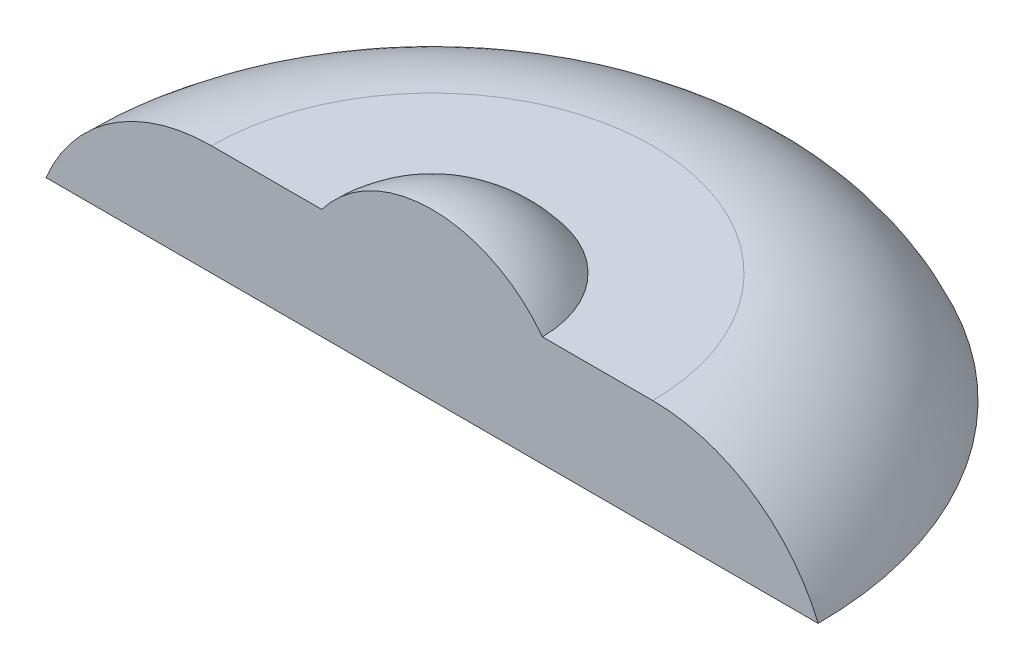
ISO-10303-21;
HEADER;
FILE_DESCRIPTION(('STEP AP214'),'2;1');
FILE_NAME('part.step','',(''),(''),'','','');
FILE_SCHEMA(('AUTOMOTIVE_DESIGN { 1 0 10303 214 1 1 1 1 }'));
ENDSEC;
DATA;
#1=APPLICATION_CONTEXT('core data for automotive mechanical design processes');
#2=APPLICATION_PROTOCOL_DEFINITION('international standard','automotive_design',2000,#1);
#3=PRODUCT_CONTEXT('',#1,'mechanical');
#4=PRODUCT('Part','Part','',(#3));
#5=PRODUCT_RELATED_PRODUCT_CATEGORY('part','',(#4));
#6=PRODUCT_DEFINITION_FORMATION('','',#4);
#7=PRODUCT_DEFINITION_CONTEXT('part definition',#1,'design');
#8=PRODUCT_DEFINITION('design','',#6,#7);
#9=PRODUCT_DEFINITION_SHAPE('','',#8);
#10=(LENGTH_UNIT() NAMED_UNIT(*) SI_UNIT(.MILLI.,.METRE.));
#11=(NAMED_UNIT(*) PLANE_ANGLE_UNIT() SI_UNIT($,.RADIAN.));
#12=(NAMED_UNIT(*) SI_UNIT($,.STERADIAN.) SOLID_ANGLE_UNIT());
#13=UNCERTAINTY_MEASURE_WITH_UNIT(LENGTH_MEASURE(1.E-05),#10,'distance_accuracy_value','');
#14=(GEOMETRIC_REPRESENTATION_CONTEXT(3) GLOBAL_UNCERTAINTY_ASSIGNED_CONTEXT((#13)) GLOBAL_UNIT_ASSIGNED_CONTEXT((#10,
#11,#12)) REPRESENTATION_CONTEXT('',''));
#15=CARTESIAN_POINT('',(0.,0.,0.));
#16=DIRECTION('',(0.,0.,1.));
#17=DIRECTION('',(1.,0.,0.));
#18=AXIS2_PLACEMENT_3D('',#15,#16,#17);
#19=CARTESIAN_POINT('',(-88.9,0.,6.20785382046309E-13));
#20=DIRECTION('',(0.,-1.,0.));
#21=DIRECTION('',(0.,0.,-1.));
#22=AXIS2_PLACEMENT_3D('',#19,#20,#21);
#23=PLANE('',#22);
#24=CARTESIAN_POINT('',(0.,0.,0.));
#25=DIRECTION('',(0.,-1.,0.));
#26=DIRECTION('',(0.,0.,-1.));
#27=AXIS2_PLACEMENT_3D('',#24,#25,#26);
#28=CIRCLE('',#27,88.9);
#29=CARTESIAN_POINT('',(-88.9,0.,6.20785382046309E-13));
#30=VERTEX_POINT('',#29);
#31=CARTESIAN_POINT('',(88.9,0.,0.));
#32=VERTEX_POINT('',#31);
#33=EDGE_CURVE('E80',#30,#32,#28,.T.);
#34=ORIENTED_EDGE('',*,*,#33,.T.);
#35=DIRECTION('',(-1.,0.,0.));
#36=VECTOR('',#35,1.);
#37=CARTESIAN_POINT('',(-88.9,0.,6.20785382046309E-13));
#38=LINE('',#37,#36);
#39=EDGE_CURVE('E69',#32,#30,#38,.T.);
#40=ORIENTED_EDGE('',*,*,#39,.T.);
#41=EDGE_LOOP('',(#34,#40));
#42=FACE_BOUND('',#41,.T.);
#43=ADVANCED_FACE('F36',(#42),#23,.T.);
#44=CARTESIAN_POINT('',(0.,6.34999999999999,0.));
#45=DIRECTION('',(0.,-1.,0.));
#46=DIRECTION('',(-1.,0.,0.));
#47=AXIS2_PLACEMENT_3D('',#44,#45,#46);
#48=SPHERICAL_SURFACE('',#47,31.75);
#49=CARTESIAN_POINT('',(0.,25.4,0.));
#50=DIRECTION('',(0.,-1.,0.));
#51=DIRECTION('',(0.,0.,-1.));
#52=AXIS2_PLACEMENT_3D('',#49,#50,#51);
#53=CIRCLE('',#52,25.4);
#54=CARTESIAN_POINT('',(-25.4,25.4,1.77367252013231E-13));
#55=VERTEX_POINT('',#54);
#56=CARTESIAN_POINT('',(25.4,25.4,0.));
#57=VERTEX_POINT('',#56);
#58=EDGE_CURVE('E11',#55,#57,#53,.T.);
#59=ORIENTED_EDGE('',*,*,#58,.F.);
#60=CARTESIAN_POINT('',(0.,6.34999999999999,0.));
#61=DIRECTION('',(0.,0.,-1.));
#62=DIRECTION('',(1.,0.,0.));
#63=AXIS2_PLACEMENT_3D('',#60,#61,#62);
#64=CIRCLE('',#63,31.75);
#65=EDGE_CURVE('E82',#55,#57,#64,.T.);
#66=ORIENTED_EDGE('',*,*,#65,.T.);
#67=EDGE_LOOP('',(#59,#66));
#68=FACE_BOUND('',#67,.T.);
#69=ADVANCED_FACE('F38',(#68),#48,.T.);
#70=CARTESIAN_POINT('',(-25.4,25.4,1.77367252013231E-13));
#71=DIRECTION('',(0.,1.,0.));
#72=DIRECTION('',(0.,0.,1.));
#73=AXIS2_PLACEMENT_3D('',#70,#71,#72);
#74=PLANE('',#73);
#75=CARTESIAN_POINT('',(0.,25.4,0.));
#76=DIRECTION('',(0.,-1.,0.));
#77=DIRECTION('',(0.,0.,-1.));
#78=AXIS2_PLACEMENT_3D('',#75,#76,#77);
#79=CIRCLE('',#78,50.8);
#80=CARTESIAN_POINT('',(-50.8,25.4,3.54734504026463E-13));
#81=VERTEX_POINT('',#80);
#82=CARTESIAN_POINT('',(50.8,25.4,0.));
#83=VERTEX_POINT('',#82);
#84=EDGE_CURVE('E44',#81,#83,#79,.T.);
#85=ORIENTED_EDGE('',*,*,#84,.F.);
#86=DIRECTION('',(1.,0.,0.));
#87=VECTOR('',#86,1.);
#88=CARTESIAN_POINT('',(-25.4,25.4,1.77367252013231E-13));
#89=LINE('',#88,#87);
#90=EDGE_CURVE('E89',#81,#55,#89,.T.);
#91=ORIENTED_EDGE('',*,*,#90,.T.);
#92=ORIENTED_EDGE('',*,*,#58,.T.);
#93=DIRECTION('',(-1.,0.,0.));
#94=VECTOR('',#93,1.);
#95=CARTESIAN_POINT('',(25.4,25.4,0.));
#96=LINE('',#95,#94);
#97=EDGE_CURVE('E78',#83,#57,#96,.T.);
#98=ORIENTED_EDGE('',*,*,#97,.F.);
#99=EDGE_LOOP('',(#85,#91,#92,#98));
#100=FACE_BOUND('',#99,.T.);
#101=ADVANCED_FACE('F92',(#100),#74,.T.);
#102=CARTESIAN_POINT('',(0.,-15.875,0.));
#103=DIRECTION('',(0.,-1.,0.));
#104=DIRECTION('',(0.,0.,-1.));
#105=AXIS2_PLACEMENT_3D('',#102,#103,#104);
#106=TOROIDAL_SURFACE('',#105,50.8,41.275);
#107=CARTESIAN_POINT('',(-50.8,-15.875,3.54734504026463E-13));
#108=DIRECTION('',(0.,0.,-1.));
#109=DIRECTION('',(1.,0.,0.));
#110=AXIS2_PLACEMENT_3D('',#107,#108,#109);
#111=CIRCLE('',#110,41.275);
#112=EDGE_CURVE('E76',#30,#81,#111,.T.);
#113=ORIENTED_EDGE('',*,*,#112,.T.);
#114=ORIENTED_EDGE('',*,*,#84,.T.);
#115=CARTESIAN_POINT('',(50.8,-15.875,0.));
#116=DIRECTION('',(0.,0.,1.));
#117=DIRECTION('',(-1.,0.,0.));
#118=AXIS2_PLACEMENT_3D('',#115,#116,#117);
#119=CIRCLE('',#118,41.275);
#120=EDGE_CURVE('E74',#32,#83,#119,.T.);
#121=ORIENTED_EDGE('',*,*,#120,.F.);
#122=ORIENTED_EDGE('',*,*,#33,.F.);
#123=EDGE_LOOP('',(#113,#114,#121,#122));
#124=FACE_BOUND('',#123,.T.);
#125=ADVANCED_FACE('F84',(#124),#106,.T.);
#126=CARTESIAN_POINT('',(0.,6.34999999999999,0.));
#127=DIRECTION('',(0.,0.,1.));
#128=DIRECTION('',(1.,0.,0.));
#129=AXIS2_PLACEMENT_3D('',#126,#127,#128);
#130=PLANE('',#129);
#131=ORIENTED_EDGE('',*,*,#39,.F.);
#132=ORIENTED_EDGE('',*,*,#120,.T.);
#133=ORIENTED_EDGE('',*,*,#97,.T.);
#134=ORIENTED_EDGE('',*,*,#65,.F.);
#135=ORIENTED_EDGE('',*,*,#90,.F.);
#136=ORIENTED_EDGE('',*,*,#112,.F.);
#137=EDGE_LOOP('',(#131,#132,#133,#134,#135,#136));
#138=FACE_BOUND('',#137,.T.);
#139=ADVANCED_FACE('F71',(#138),#130,.T.);
#140=CLOSED_SHELL('',(#43,#69,#101,#125,#139));
#141=MANIFOLD_SOLID_BREP('B2',#140);
#142=ADVANCED_BREP_SHAPE_REPRESENTATION('',(#18,#141),#14);
#143=SHAPE_DEFINITION_REPRESENTATION(#9,#142);
ENDSEC;
END-ISO-10303-21;
